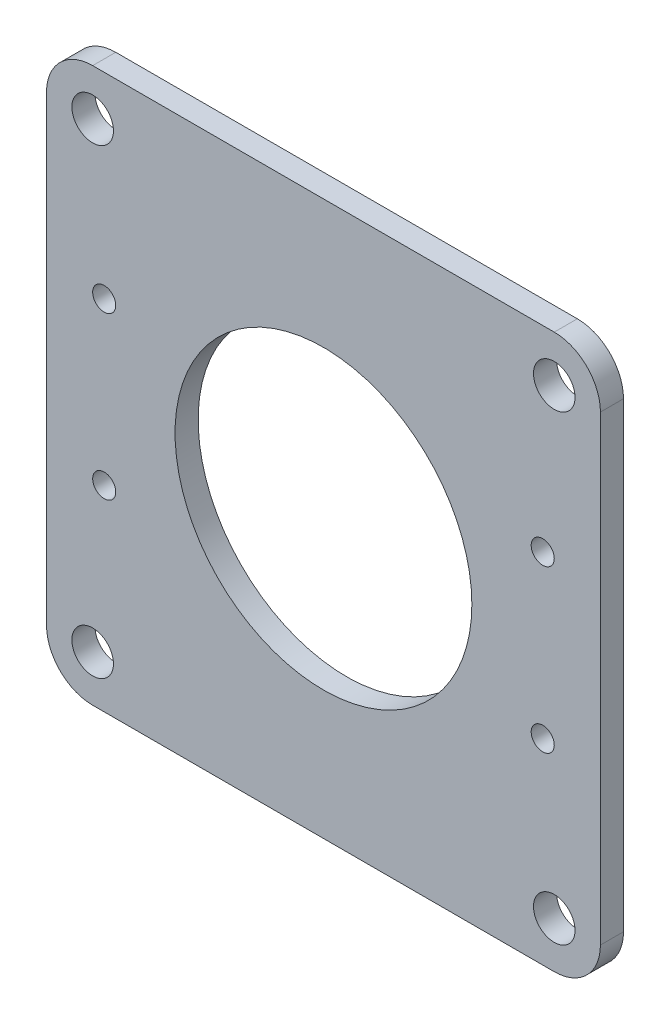
ISO-10303-21;
HEADER;
FILE_DESCRIPTION(('STEP AP214'),'2;1');
FILE_NAME('part.step','',(''),(''),'','','');
FILE_SCHEMA(('AUTOMOTIVE_DESIGN { 1 0 10303 214 1 1 1 1 }'));
ENDSEC;
DATA;
#1=APPLICATION_CONTEXT('core data for automotive mechanical design processes');
#2=APPLICATION_PROTOCOL_DEFINITION('international standard','automotive_design',2000,#1);
#3=PRODUCT_CONTEXT('',#1,'mechanical');
#4=PRODUCT('Part','Part','',(#3));
#5=PRODUCT_RELATED_PRODUCT_CATEGORY('part','',(#4));
#6=PRODUCT_DEFINITION_FORMATION('','',#4);
#7=PRODUCT_DEFINITION_CONTEXT('part definition',#1,'design');
#8=PRODUCT_DEFINITION('design','',#6,#7);
#9=PRODUCT_DEFINITION_SHAPE('','',#8);
#10=(LENGTH_UNIT() NAMED_UNIT(*) SI_UNIT(.MILLI.,.METRE.));
#11=(NAMED_UNIT(*) PLANE_ANGLE_UNIT() SI_UNIT($,.RADIAN.));
#12=(NAMED_UNIT(*) SI_UNIT($,.STERADIAN.) SOLID_ANGLE_UNIT());
#13=UNCERTAINTY_MEASURE_WITH_UNIT(LENGTH_MEASURE(1.E-05),#10,'distance_accuracy_value','');
#14=(GEOMETRIC_REPRESENTATION_CONTEXT(3) GLOBAL_UNCERTAINTY_ASSIGNED_CONTEXT((#13)) GLOBAL_UNIT_ASSIGNED_CONTEXT((#10,
#11,#12)) REPRESENTATION_CONTEXT('',''));
#15=CARTESIAN_POINT('',(0.,0.,0.));
#16=DIRECTION('',(0.,0.,1.));
#17=DIRECTION('',(1.,0.,0.));
#18=AXIS2_PLACEMENT_3D('',#15,#16,#17);
#19=CARTESIAN_POINT('',(0.,113.639067485698,5.));
#20=DIRECTION('',(0.,1.,0.));
#21=DIRECTION('',(-1.,0.,0.));
#22=AXIS2_PLACEMENT_3D('',#19,#20,#21);
#23=PLANE('',#22);
#24=DIRECTION('',(1.,0.,0.));
#25=VECTOR('',#24,1.);
#26=CARTESIAN_POINT('',(0.,113.639067485698,5.));
#27=LINE('',#26,#25);
#28=CARTESIAN_POINT('',(-40.3221278017968,113.639067485698,5.));
#29=VERTEX_POINT('',#28);
#30=CARTESIAN_POINT('',(59.6778721982036,113.639067485698,5.));
#31=VERTEX_POINT('',#30);
#32=EDGE_CURVE('E194',#29,#31,#27,.T.);
#33=ORIENTED_EDGE('',*,*,#32,.F.);
#34=DIRECTION('',(0.,0.,1.));
#35=VECTOR('',#34,1.);
#36=CARTESIAN_POINT('',(-40.3221278017968,113.639067485698,5.));
#37=LINE('',#36,#35);
#38=CARTESIAN_POINT('',(-40.3221278017968,113.639067485698,0.));
#39=VERTEX_POINT('',#38);
#40=EDGE_CURVE('E115',#29,#39,#37,.F.);
#41=ORIENTED_EDGE('',*,*,#40,.T.);
#42=DIRECTION('',(1.,0.,0.));
#43=VECTOR('',#42,1.);
#44=CARTESIAN_POINT('',(0.,113.639067485698,0.));
#45=LINE('',#44,#43);
#46=CARTESIAN_POINT('',(59.6778721982036,113.639067485698,0.));
#47=VERTEX_POINT('',#46);
#48=EDGE_CURVE('E231',#39,#47,#45,.T.);
#49=ORIENTED_EDGE('',*,*,#48,.T.);
#50=DIRECTION('',(0.,0.,1.));
#51=VECTOR('',#50,1.);
#52=CARTESIAN_POINT('',(59.6778721982036,113.639067485698,5.));
#53=LINE('',#52,#51);
#54=EDGE_CURVE('E121',#47,#31,#53,.T.);
#55=ORIENTED_EDGE('',*,*,#54,.T.);
#56=EDGE_LOOP('',(#33,#41,#49,#55));
#57=FACE_BOUND('',#56,.T.);
#58=ADVANCED_FACE('F43',(#57),#23,.F.);
#59=CARTESIAN_POINT('',(-40.3221278017959,223.639067485698,5.));
#60=DIRECTION('',(0.,0.,-1.));
#61=DIRECTION('',(-1.,0.,0.));
#62=AXIS2_PLACEMENT_3D('',#59,#60,#61);
#63=CYLINDRICAL_SURFACE('',#62,4.50000000000001);
#64=CARTESIAN_POINT('',(-40.3221278017959,223.639067485698,5.));
#65=DIRECTION('',(0.,0.,1.));
#66=DIRECTION('',(1.,0.,0.));
#67=AXIS2_PLACEMENT_3D('',#64,#65,#66);
#68=CIRCLE('',#67,4.50000000000001);
#69=CARTESIAN_POINT('',(-35.8221278017959,223.639067485698,5.));
#70=VERTEX_POINT('',#69);
#71=EDGE_CURVE('E190',#70,#70,#68,.T.);
#72=ORIENTED_EDGE('',*,*,#71,.T.);
#73=EDGE_LOOP('',(#72));
#74=FACE_BOUND('',#73,.T.);
#75=CARTESIAN_POINT('',(-40.3221278017959,223.639067485698,0.));
#76=DIRECTION('',(0.,0.,1.));
#77=DIRECTION('',(1.,0.,0.));
#78=AXIS2_PLACEMENT_3D('',#75,#76,#77);
#79=CIRCLE('',#78,4.50000000000001);
#80=CARTESIAN_POINT('',(-35.8221278017959,223.639067485698,0.));
#81=VERTEX_POINT('',#80);
#82=EDGE_CURVE('E227',#81,#81,#79,.T.);
#83=ORIENTED_EDGE('',*,*,#82,.F.);
#84=EDGE_LOOP('',(#83));
#85=FACE_BOUND('',#84,.T.);
#86=ADVANCED_FACE('F293',(#74,#85),#63,.F.);
#87=CARTESIAN_POINT('',(59.6778721982039,223.639067485698,5.));
#88=DIRECTION('',(0.,0.,-1.));
#89=DIRECTION('',(-1.,0.,0.));
#90=AXIS2_PLACEMENT_3D('',#87,#88,#89);
#91=CYLINDRICAL_SURFACE('',#90,4.5);
#92=CARTESIAN_POINT('',(59.6778721982039,223.639067485698,5.));
#93=DIRECTION('',(0.,0.,1.));
#94=DIRECTION('',(1.,0.,0.));
#95=AXIS2_PLACEMENT_3D('',#92,#93,#94);
#96=CIRCLE('',#95,4.5);
#97=CARTESIAN_POINT('',(64.1778721982039,223.639067485698,5.));
#98=VERTEX_POINT('',#97);
#99=EDGE_CURVE('E186',#98,#98,#96,.T.);
#100=ORIENTED_EDGE('',*,*,#99,.T.);
#101=EDGE_LOOP('',(#100));
#102=FACE_BOUND('',#101,.T.);
#103=CARTESIAN_POINT('',(59.6778721982039,223.639067485698,0.));
#104=DIRECTION('',(0.,0.,1.));
#105=DIRECTION('',(1.,0.,0.));
#106=AXIS2_PLACEMENT_3D('',#103,#104,#105);
#107=CIRCLE('',#106,4.5);
#108=CARTESIAN_POINT('',(64.1778721982039,223.639067485698,0.));
#109=VERTEX_POINT('',#108);
#110=EDGE_CURVE('E223',#109,#109,#107,.T.);
#111=ORIENTED_EDGE('',*,*,#110,.F.);
#112=EDGE_LOOP('',(#111));
#113=FACE_BOUND('',#112,.T.);
#114=ADVANCED_FACE('F297',(#102,#113),#91,.F.);
#115=CARTESIAN_POINT('',(57.1778721982039,191.139067485698,5.));
#116=DIRECTION('',(0.,0.,-1.));
#117=DIRECTION('',(-1.,0.,0.));
#118=AXIS2_PLACEMENT_3D('',#115,#116,#117);
#119=CYLINDRICAL_SURFACE('',#118,2.49999999999993);
#120=CARTESIAN_POINT('',(57.1778721982039,191.139067485698,5.));
#121=DIRECTION('',(0.,0.,1.));
#122=DIRECTION('',(1.,0.,0.));
#123=AXIS2_PLACEMENT_3D('',#120,#121,#122);
#124=CIRCLE('',#123,2.49999999999993);
#125=CARTESIAN_POINT('',(59.6778721982039,191.139067485698,5.));
#126=VERTEX_POINT('',#125);
#127=EDGE_CURVE('E182',#126,#126,#124,.T.);
#128=ORIENTED_EDGE('',*,*,#127,.T.);
#129=EDGE_LOOP('',(#128));
#130=FACE_BOUND('',#129,.T.);
#131=CARTESIAN_POINT('',(57.1778721982039,191.139067485698,0.));
#132=DIRECTION('',(0.,0.,1.));
#133=DIRECTION('',(1.,0.,0.));
#134=AXIS2_PLACEMENT_3D('',#131,#132,#133);
#135=CIRCLE('',#134,2.49999999999993);
#136=CARTESIAN_POINT('',(59.6778721982039,191.139067485698,0.));
#137=VERTEX_POINT('',#136);
#138=EDGE_CURVE('E220',#137,#137,#135,.T.);
#139=ORIENTED_EDGE('',*,*,#138,.F.);
#140=EDGE_LOOP('',(#139));
#141=FACE_BOUND('',#140,.T.);
#142=ADVANCED_FACE('F305',(#130,#141),#119,.F.);
#143=CARTESIAN_POINT('',(57.1778721982037,156.139067485698,5.));
#144=DIRECTION('',(0.,0.,-1.));
#145=DIRECTION('',(-1.,0.,0.));
#146=AXIS2_PLACEMENT_3D('',#143,#144,#145);
#147=CYLINDRICAL_SURFACE('',#146,2.50000000000002);
#148=CARTESIAN_POINT('',(57.1778721982037,156.139067485698,5.));
#149=DIRECTION('',(0.,0.,1.));
#150=DIRECTION('',(1.,0.,0.));
#151=AXIS2_PLACEMENT_3D('',#148,#149,#150);
#152=CIRCLE('',#151,2.50000000000002);
#153=CARTESIAN_POINT('',(59.6778721982037,156.139067485698,5.));
#154=VERTEX_POINT('',#153);
#155=EDGE_CURVE('E178',#154,#154,#152,.T.);
#156=ORIENTED_EDGE('',*,*,#155,.T.);
#157=EDGE_LOOP('',(#156));
#158=FACE_BOUND('',#157,.T.);
#159=CARTESIAN_POINT('',(57.1778721982037,156.139067485698,0.));
#160=DIRECTION('',(0.,0.,1.));
#161=DIRECTION('',(1.,0.,0.));
#162=AXIS2_PLACEMENT_3D('',#159,#160,#161);
#163=CIRCLE('',#162,2.50000000000002);
#164=CARTESIAN_POINT('',(59.6778721982037,156.139067485698,0.));
#165=VERTEX_POINT('',#164);
#166=EDGE_CURVE('E216',#165,#165,#163,.T.);
#167=ORIENTED_EDGE('',*,*,#166,.F.);
#168=EDGE_LOOP('',(#167));
#169=FACE_BOUND('',#168,.T.);
#170=ADVANCED_FACE('F309',(#158,#169),#147,.F.);
#171=CARTESIAN_POINT('',(59.6778721982039,123.639067485698,5.));
#172=DIRECTION('',(0.,0.,-1.));
#173=DIRECTION('',(-1.,0.,0.));
#174=AXIS2_PLACEMENT_3D('',#171,#172,#173);
#175=CYLINDRICAL_SURFACE('',#174,4.49999999999999);
#176=CARTESIAN_POINT('',(59.6778721982039,123.639067485698,5.));
#177=DIRECTION('',(0.,0.,1.));
#178=DIRECTION('',(1.,0.,0.));
#179=AXIS2_PLACEMENT_3D('',#176,#177,#178);
#180=CIRCLE('',#179,4.49999999999999);
#181=CARTESIAN_POINT('',(64.1778721982039,123.639067485698,5.));
#182=VERTEX_POINT('',#181);
#183=EDGE_CURVE('E174',#182,#182,#180,.T.);
#184=ORIENTED_EDGE('',*,*,#183,.T.);
#185=EDGE_LOOP('',(#184));
#186=FACE_BOUND('',#185,.T.);
#187=CARTESIAN_POINT('',(59.6778721982039,123.639067485698,0.));
#188=DIRECTION('',(0.,0.,1.));
#189=DIRECTION('',(1.,0.,0.));
#190=AXIS2_PLACEMENT_3D('',#187,#188,#189);
#191=CIRCLE('',#190,4.49999999999999);
#192=CARTESIAN_POINT('',(64.1778721982039,123.639067485698,0.));
#193=VERTEX_POINT('',#192);
#194=EDGE_CURVE('E212',#193,#193,#191,.T.);
#195=ORIENTED_EDGE('',*,*,#194,.F.);
#196=EDGE_LOOP('',(#195));
#197=FACE_BOUND('',#196,.T.);
#198=ADVANCED_FACE('F313',(#186,#197),#175,.F.);
#199=CARTESIAN_POINT('',(-40.3221278017963,123.639067485698,5.));
#200=DIRECTION('',(0.,0.,-1.));
#201=DIRECTION('',(-1.,0.,0.));
#202=AXIS2_PLACEMENT_3D('',#199,#200,#201);
#203=CYLINDRICAL_SURFACE('',#202,4.49999999999994);
#204=CARTESIAN_POINT('',(-40.3221278017963,123.639067485698,5.));
#205=DIRECTION('',(0.,0.,1.));
#206=DIRECTION('',(1.,0.,0.));
#207=AXIS2_PLACEMENT_3D('',#204,#205,#206);
#208=CIRCLE('',#207,4.49999999999994);
#209=CARTESIAN_POINT('',(-35.8221278017964,123.639067485698,5.));
#210=VERTEX_POINT('',#209);
#211=EDGE_CURVE('E170',#210,#210,#208,.T.);
#212=ORIENTED_EDGE('',*,*,#211,.T.);
#213=EDGE_LOOP('',(#212));
#214=FACE_BOUND('',#213,.T.);
#215=CARTESIAN_POINT('',(-40.3221278017963,123.639067485698,0.));
#216=DIRECTION('',(0.,0.,1.));
#217=DIRECTION('',(1.,0.,0.));
#218=AXIS2_PLACEMENT_3D('',#215,#216,#217);
#219=CIRCLE('',#218,4.49999999999994);
#220=CARTESIAN_POINT('',(-35.8221278017964,123.639067485698,0.));
#221=VERTEX_POINT('',#220);
#222=EDGE_CURVE('E208',#221,#221,#219,.T.);
#223=ORIENTED_EDGE('',*,*,#222,.F.);
#224=EDGE_LOOP('',(#223));
#225=FACE_BOUND('',#224,.T.);
#226=ADVANCED_FACE('F317',(#214,#225),#203,.F.);
#227=CARTESIAN_POINT('',(-37.8221278017961,156.139067485698,5.));
#228=DIRECTION('',(0.,0.,-1.));
#229=DIRECTION('',(-1.,0.,0.));
#230=AXIS2_PLACEMENT_3D('',#227,#228,#229);
#231=CYLINDRICAL_SURFACE('',#230,2.49999999999994);
#232=CARTESIAN_POINT('',(-37.8221278017961,156.139067485698,5.));
#233=DIRECTION('',(0.,0.,1.));
#234=DIRECTION('',(1.,0.,0.));
#235=AXIS2_PLACEMENT_3D('',#232,#233,#234);
#236=CIRCLE('',#235,2.49999999999994);
#237=CARTESIAN_POINT('',(-35.3221278017962,156.139067485698,5.));
#238=VERTEX_POINT('',#237);
#239=EDGE_CURVE('E165',#238,#238,#236,.T.);
#240=ORIENTED_EDGE('',*,*,#239,.T.);
#241=EDGE_LOOP('',(#240));
#242=FACE_BOUND('',#241,.T.);
#243=CARTESIAN_POINT('',(-37.8221278017961,156.139067485698,0.));
#244=DIRECTION('',(0.,0.,1.));
#245=DIRECTION('',(1.,0.,0.));
#246=AXIS2_PLACEMENT_3D('',#243,#244,#245);
#247=CIRCLE('',#246,2.49999999999994);
#248=CARTESIAN_POINT('',(-35.3221278017962,156.139067485698,0.));
#249=VERTEX_POINT('',#248);
#250=EDGE_CURVE('E204',#249,#249,#247,.T.);
#251=ORIENTED_EDGE('',*,*,#250,.F.);
#252=EDGE_LOOP('',(#251));
#253=FACE_BOUND('',#252,.T.);
#254=ADVANCED_FACE('F321',(#242,#253),#231,.F.);
#255=CARTESIAN_POINT('',(-37.822127801796,191.139067485698,5.));
#256=DIRECTION('',(0.,0.,-1.));
#257=DIRECTION('',(-1.,0.,0.));
#258=AXIS2_PLACEMENT_3D('',#255,#256,#257);
#259=CYLINDRICAL_SURFACE('',#258,2.49999999999993);
#260=CARTESIAN_POINT('',(-37.822127801796,191.139067485698,5.));
#261=DIRECTION('',(0.,0.,1.));
#262=DIRECTION('',(1.,0.,0.));
#263=AXIS2_PLACEMENT_3D('',#260,#261,#262);
#264=CIRCLE('',#263,2.49999999999993);
#265=CARTESIAN_POINT('',(-35.3221278017961,191.139067485698,5.));
#266=VERTEX_POINT('',#265);
#267=EDGE_CURVE('E161',#266,#266,#264,.T.);
#268=ORIENTED_EDGE('',*,*,#267,.T.);
#269=EDGE_LOOP('',(#268));
#270=FACE_BOUND('',#269,.T.);
#271=CARTESIAN_POINT('',(-37.822127801796,191.139067485698,0.));
#272=DIRECTION('',(0.,0.,1.));
#273=DIRECTION('',(1.,0.,0.));
#274=AXIS2_PLACEMENT_3D('',#271,#272,#273);
#275=CIRCLE('',#274,2.49999999999993);
#276=CARTESIAN_POINT('',(-35.3221278017961,191.139067485698,0.));
#277=VERTEX_POINT('',#276);
#278=EDGE_CURVE('E160',#277,#277,#275,.T.);
#279=ORIENTED_EDGE('',*,*,#278,.F.);
#280=EDGE_LOOP('',(#279));
#281=FACE_BOUND('',#280,.T.);
#282=ADVANCED_FACE('F325',(#270,#281),#259,.F.);
#283=CARTESIAN_POINT('',(0.,233.639067485698,5.));
#284=DIRECTION('',(0.,1.,0.));
#285=DIRECTION('',(0.,0.,1.));
#286=AXIS2_PLACEMENT_3D('',#283,#284,#285);
#287=PLANE('',#286);
#288=DIRECTION('',(1.,0.,0.));
#289=VECTOR('',#288,1.);
#290=CARTESIAN_POINT('',(0.,233.639067485698,5.));
#291=LINE('',#290,#289);
#292=CARTESIAN_POINT('',(-40.3221278017987,233.639067485698,5.));
#293=VERTEX_POINT('',#292);
#294=CARTESIAN_POINT('',(59.6778721982055,233.639067485698,5.));
#295=VERTEX_POINT('',#294);
#296=EDGE_CURVE('E197',#293,#295,#291,.T.);
#297=ORIENTED_EDGE('',*,*,#296,.T.);
#298=DIRECTION('',(0.,0.,1.));
#299=VECTOR('',#298,1.);
#300=CARTESIAN_POINT('',(59.6778721982055,233.639067485698,0.));
#301=LINE('',#300,#299);
#302=CARTESIAN_POINT('',(59.6778721982055,233.639067485698,0.));
#303=VERTEX_POINT('',#302);
#304=EDGE_CURVE('E11',#295,#303,#301,.F.);
#305=ORIENTED_EDGE('',*,*,#304,.T.);
#306=DIRECTION('',(1.,0.,0.));
#307=VECTOR('',#306,1.);
#308=CARTESIAN_POINT('',(0.,233.639067485698,0.));
#309=LINE('',#308,#307);
#310=CARTESIAN_POINT('',(-40.3221278017987,233.639067485698,0.));
#311=VERTEX_POINT('',#310);
#312=EDGE_CURVE('E166',#311,#303,#309,.T.);
#313=ORIENTED_EDGE('',*,*,#312,.F.);
#314=DIRECTION('',(0.,0.,1.));
#315=VECTOR('',#314,1.);
#316=CARTESIAN_POINT('',(-40.3221278017987,233.639067485698,5.));
#317=LINE('',#316,#315);
#318=EDGE_CURVE('E52',#311,#293,#317,.T.);
#319=ORIENTED_EDGE('',*,*,#318,.T.);
#320=EDGE_LOOP('',(#297,#305,#313,#319));
#321=FACE_BOUND('',#320,.T.);
#322=ADVANCED_FACE('F271',(#321),#287,.T.);
#323=CARTESIAN_POINT('',(0.,0.,5.));
#324=DIRECTION('',(0.,0.,1.));
#325=DIRECTION('',(1.,0.,0.));
#326=AXIS2_PLACEMENT_3D('',#323,#324,#325);
#327=PLANE('',#326);
#328=DIRECTION('',(0.,1.,0.));
#329=VECTOR('',#328,1.);
#330=CARTESIAN_POINT('',(-50.3221278017966,113.639067485698,5.));
#331=LINE('',#330,#329);
#332=CARTESIAN_POINT('',(-50.3221278017968,123.639067485698,5.));
#333=VERTEX_POINT('',#332);
#334=CARTESIAN_POINT('',(-50.3221278017987,223.639067485698,5.));
#335=VERTEX_POINT('',#334);
#336=EDGE_CURVE('E128',#333,#335,#331,.T.);
#337=ORIENTED_EDGE('',*,*,#336,.F.);
#338=CARTESIAN_POINT('',(-40.3221278017968,123.639067485698,5.));
#339=DIRECTION('',(0.,0.,1.));
#340=DIRECTION('',(1.,0.,0.));
#341=AXIS2_PLACEMENT_3D('',#338,#339,#340);
#342=CIRCLE('',#341,10.);
#343=EDGE_CURVE('E110',#333,#29,#342,.T.);
#344=ORIENTED_EDGE('',*,*,#343,.T.);
#345=ORIENTED_EDGE('',*,*,#32,.T.);
#346=CARTESIAN_POINT('',(59.6778721982036,123.639067485698,5.));
#347=DIRECTION('',(0.,0.,1.));
#348=DIRECTION('',(1.,0.,0.));
#349=AXIS2_PLACEMENT_3D('',#346,#347,#348);
#350=CIRCLE('',#349,10.);
#351=CARTESIAN_POINT('',(69.6778721982036,123.639067485698,5.));
#352=VERTEX_POINT('',#351);
#353=EDGE_CURVE('E122',#31,#352,#350,.T.);
#354=ORIENTED_EDGE('',*,*,#353,.T.);
#355=DIRECTION('',(0.,-1.,0.));
#356=VECTOR('',#355,1.);
#357=CARTESIAN_POINT('',(69.6778721982034,113.639067485698,5.));
#358=LINE('',#357,#356);
#359=CARTESIAN_POINT('',(69.6778721982054,223.639067485698,5.));
#360=VERTEX_POINT('',#359);
#361=EDGE_CURVE('E140',#360,#352,#358,.T.);
#362=ORIENTED_EDGE('',*,*,#361,.F.);
#363=CARTESIAN_POINT('',(59.6778721982055,223.639067485698,5.));
#364=DIRECTION('',(0.,0.,1.));
#365=DIRECTION('',(1.,0.,0.));
#366=AXIS2_PLACEMENT_3D('',#363,#364,#365);
#367=CIRCLE('',#366,10.);
#368=EDGE_CURVE('E241',#360,#295,#367,.T.);
#369=ORIENTED_EDGE('',*,*,#368,.T.);
#370=ORIENTED_EDGE('',*,*,#296,.F.);
#371=CARTESIAN_POINT('',(-40.3221278017987,223.639067485698,5.));
#372=DIRECTION('',(0.,0.,1.));
#373=DIRECTION('',(1.,0.,0.));
#374=AXIS2_PLACEMENT_3D('',#371,#372,#373);
#375=CIRCLE('',#374,10.);
#376=EDGE_CURVE('E133',#293,#335,#375,.T.);
#377=ORIENTED_EDGE('',*,*,#376,.T.);
#378=EDGE_LOOP('',(#337,#344,#345,#354,#362,#369,#370,#377));
#379=FACE_BOUND('',#378,.T.);
#380=ORIENTED_EDGE('',*,*,#267,.F.);
#381=EDGE_LOOP('',(#380));
#382=FACE_BOUND('',#381,.T.);
#383=ORIENTED_EDGE('',*,*,#239,.F.);
#384=EDGE_LOOP('',(#383));
#385=FACE_BOUND('',#384,.T.);
#386=ORIENTED_EDGE('',*,*,#211,.F.);
#387=EDGE_LOOP('',(#386));
#388=FACE_BOUND('',#387,.T.);
#389=ORIENTED_EDGE('',*,*,#183,.F.);
#390=EDGE_LOOP('',(#389));
#391=FACE_BOUND('',#390,.T.);
#392=ORIENTED_EDGE('',*,*,#155,.F.);
#393=EDGE_LOOP('',(#392));
#394=FACE_BOUND('',#393,.T.);
#395=ORIENTED_EDGE('',*,*,#127,.F.);
#396=EDGE_LOOP('',(#395));
#397=FACE_BOUND('',#396,.T.);
#398=ORIENTED_EDGE('',*,*,#99,.F.);
#399=EDGE_LOOP('',(#398));
#400=FACE_BOUND('',#399,.T.);
#401=ORIENTED_EDGE('',*,*,#71,.F.);
#402=EDGE_LOOP('',(#401));
#403=FACE_BOUND('',#402,.T.);
#404=CARTESIAN_POINT('',(9.6778721982034,173.639067485698,5.));
#405=DIRECTION('',(0.,0.,1.));
#406=DIRECTION('',(1.,0.,0.));
#407=AXIS2_PLACEMENT_3D('',#404,#405,#406);
#408=CIRCLE('',#407,32.15);
#409=CARTESIAN_POINT('',(41.8278721982034,173.639067485698,5.));
#410=VERTEX_POINT('',#409);
#411=EDGE_CURVE('E145',#410,#410,#408,.T.);
#412=ORIENTED_EDGE('',*,*,#411,.F.);
#413=EDGE_LOOP('',(#412));
#414=FACE_BOUND('',#413,.T.);
#415=ADVANCED_FACE('F136',(#379,#382,#385,#388,#391,#394,#397,#400,#403,#414),#327,.T.);
#416=CARTESIAN_POINT('',(0.,0.,0.));
#417=DIRECTION('',(0.,0.,1.));
#418=DIRECTION('',(1.,0.,0.));
#419=AXIS2_PLACEMENT_3D('',#416,#417,#418);
#420=PLANE('',#419);
#421=ORIENTED_EDGE('',*,*,#278,.T.);
#422=EDGE_LOOP('',(#421));
#423=FACE_BOUND('',#422,.T.);
#424=ORIENTED_EDGE('',*,*,#250,.T.);
#425=EDGE_LOOP('',(#424));
#426=FACE_BOUND('',#425,.T.);
#427=ORIENTED_EDGE('',*,*,#222,.T.);
#428=EDGE_LOOP('',(#427));
#429=FACE_BOUND('',#428,.T.);
#430=ORIENTED_EDGE('',*,*,#194,.T.);
#431=EDGE_LOOP('',(#430));
#432=FACE_BOUND('',#431,.T.);
#433=ORIENTED_EDGE('',*,*,#166,.T.);
#434=EDGE_LOOP('',(#433));
#435=FACE_BOUND('',#434,.T.);
#436=ORIENTED_EDGE('',*,*,#138,.T.);
#437=EDGE_LOOP('',(#436));
#438=FACE_BOUND('',#437,.T.);
#439=ORIENTED_EDGE('',*,*,#110,.T.);
#440=EDGE_LOOP('',(#439));
#441=FACE_BOUND('',#440,.T.);
#442=ORIENTED_EDGE('',*,*,#82,.T.);
#443=EDGE_LOOP('',(#442));
#444=FACE_BOUND('',#443,.T.);
#445=ORIENTED_EDGE('',*,*,#48,.F.);
#446=CARTESIAN_POINT('',(-40.3221278017968,123.639067485698,0.));
#447=DIRECTION('',(0.,0.,1.));
#448=DIRECTION('',(1.,0.,0.));
#449=AXIS2_PLACEMENT_3D('',#446,#447,#448);
#450=CIRCLE('',#449,10.);
#451=CARTESIAN_POINT('',(-50.3221278017968,123.639067485698,0.));
#452=VERTEX_POINT('',#451);
#453=EDGE_CURVE('E258',#39,#452,#450,.F.);
#454=ORIENTED_EDGE('',*,*,#453,.T.);
#455=DIRECTION('',(0.,1.,0.));
#456=VECTOR('',#455,1.);
#457=CARTESIAN_POINT('',(-50.3221278017966,113.639067485698,0.));
#458=LINE('',#457,#456);
#459=CARTESIAN_POINT('',(-50.3221278017987,223.639067485698,0.));
#460=VERTEX_POINT('',#459);
#461=EDGE_CURVE('E131',#452,#460,#458,.T.);
#462=ORIENTED_EDGE('',*,*,#461,.T.);
#463=CARTESIAN_POINT('',(-40.3221278017987,223.639067485698,0.));
#464=DIRECTION('',(0.,0.,1.));
#465=DIRECTION('',(1.,0.,0.));
#466=AXIS2_PLACEMENT_3D('',#463,#464,#465);
#467=CIRCLE('',#466,10.);
#468=EDGE_CURVE('E250',#460,#311,#467,.F.);
#469=ORIENTED_EDGE('',*,*,#468,.T.);
#470=ORIENTED_EDGE('',*,*,#312,.T.);
#471=CARTESIAN_POINT('',(59.6778721982055,223.639067485698,0.));
#472=DIRECTION('',(0.,0.,1.));
#473=DIRECTION('',(1.,0.,0.));
#474=AXIS2_PLACEMENT_3D('',#471,#472,#473);
#475=CIRCLE('',#474,10.);
#476=CARTESIAN_POINT('',(69.6778721982054,223.639067485698,0.));
#477=VERTEX_POINT('',#476);
#478=EDGE_CURVE('E66',#303,#477,#475,.F.);
#479=ORIENTED_EDGE('',*,*,#478,.T.);
#480=DIRECTION('',(0.,-1.,0.));
#481=VECTOR('',#480,1.);
#482=CARTESIAN_POINT('',(69.6778721982034,113.639067485698,0.));
#483=LINE('',#482,#481);
#484=CARTESIAN_POINT('',(69.6778721982036,123.639067485698,0.));
#485=VERTEX_POINT('',#484);
#486=EDGE_CURVE('E148',#477,#485,#483,.T.);
#487=ORIENTED_EDGE('',*,*,#486,.T.);
#488=CARTESIAN_POINT('',(59.6778721982036,123.639067485698,0.));
#489=DIRECTION('',(0.,0.,1.));
#490=DIRECTION('',(1.,0.,0.));
#491=AXIS2_PLACEMENT_3D('',#488,#489,#490);
#492=CIRCLE('',#491,10.);
#493=EDGE_CURVE('E255',#485,#47,#492,.F.);
#494=ORIENTED_EDGE('',*,*,#493,.T.);
#495=EDGE_LOOP('',(#445,#454,#462,#469,#470,#479,#487,#494));
#496=FACE_BOUND('',#495,.T.);
#497=CARTESIAN_POINT('',(9.6778721982034,173.639067485698,0.));
#498=DIRECTION('',(0.,0.,1.));
#499=DIRECTION('',(1.,0.,0.));
#500=AXIS2_PLACEMENT_3D('',#497,#498,#499);
#501=CIRCLE('',#500,32.15);
#502=CARTESIAN_POINT('',(41.8278721982034,173.639067485698,0.));
#503=VERTEX_POINT('',#502);
#504=EDGE_CURVE('E156',#503,#503,#501,.F.);
#505=ORIENTED_EDGE('',*,*,#504,.F.);
#506=EDGE_LOOP('',(#505));
#507=FACE_BOUND('',#506,.T.);
#508=ADVANCED_FACE('F282',(#423,#426,#429,#432,#435,#438,#441,#444,#496,#507),#420,.F.);
#509=CARTESIAN_POINT('',(9.6778721982034,173.639067485698,-110.308657865102));
#510=DIRECTION('',(0.,0.,1.));
#511=DIRECTION('',(1.,0.,0.));
#512=AXIS2_PLACEMENT_3D('',#509,#510,#511);
#513=CYLINDRICAL_SURFACE('',#512,32.15);
#514=ORIENTED_EDGE('',*,*,#504,.T.);
#515=EDGE_LOOP('',(#514));
#516=FACE_BOUND('',#515,.T.);
#517=ORIENTED_EDGE('',*,*,#411,.T.);
#518=EDGE_LOOP('',(#517));
#519=FACE_BOUND('',#518,.T.);
#520=ADVANCED_FACE('F384',(#516,#519),#513,.F.);
#521=CARTESIAN_POINT('',(69.6778721982034,113.639067485698,0.));
#522=DIRECTION('',(-1.,0.,0.));
#523=DIRECTION('',(0.,-1.,0.));
#524=AXIS2_PLACEMENT_3D('',#521,#522,#523);
#525=PLANE('',#524);
#526=ORIENTED_EDGE('',*,*,#361,.T.);
#527=DIRECTION('',(0.,0.,1.));
#528=VECTOR('',#527,1.);
#529=CARTESIAN_POINT('',(69.6778721982036,123.639067485698,0.));
#530=LINE('',#529,#528);
#531=EDGE_CURVE('E59',#352,#485,#530,.F.);
#532=ORIENTED_EDGE('',*,*,#531,.T.);
#533=ORIENTED_EDGE('',*,*,#486,.F.);
#534=DIRECTION('',(0.,0.,1.));
#535=VECTOR('',#534,1.);
#536=CARTESIAN_POINT('',(69.6778721982054,223.639067485698,5.));
#537=LINE('',#536,#535);
#538=EDGE_CURVE('E261',#477,#360,#537,.T.);
#539=ORIENTED_EDGE('',*,*,#538,.T.);
#540=EDGE_LOOP('',(#526,#532,#533,#539));
#541=FACE_BOUND('',#540,.T.);
#542=ADVANCED_FACE('F279',(#541),#525,.F.);
#543=CARTESIAN_POINT('',(-50.3221278017966,113.639067485698,0.));
#544=DIRECTION('',(1.,0.,0.));
#545=DIRECTION('',(0.,1.,0.));
#546=AXIS2_PLACEMENT_3D('',#543,#544,#545);
#547=PLANE('',#546);
#548=ORIENTED_EDGE('',*,*,#461,.F.);
#549=DIRECTION('',(0.,0.,1.));
#550=VECTOR('',#549,1.);
#551=CARTESIAN_POINT('',(-50.3221278017968,123.639067485698,0.));
#552=LINE('',#551,#550);
#553=EDGE_CURVE('E114',#452,#333,#552,.T.);
#554=ORIENTED_EDGE('',*,*,#553,.T.);
#555=ORIENTED_EDGE('',*,*,#336,.T.);
#556=DIRECTION('',(0.,0.,1.));
#557=VECTOR('',#556,1.);
#558=CARTESIAN_POINT('',(-50.3221278017987,223.639067485698,0.));
#559=LINE('',#558,#557);
#560=EDGE_CURVE('E134',#335,#460,#559,.F.);
#561=ORIENTED_EDGE('',*,*,#560,.T.);
#562=EDGE_LOOP('',(#548,#554,#555,#561));
#563=FACE_BOUND('',#562,.T.);
#564=ADVANCED_FACE('F127',(#563),#547,.F.);
#565=CARTESIAN_POINT('',(-40.3221278017968,123.639067485698,0.));
#566=DIRECTION('',(0.,0.,1.));
#567=DIRECTION('',(1.,0.,0.));
#568=AXIS2_PLACEMENT_3D('',#565,#566,#567);
#569=CYLINDRICAL_SURFACE('',#568,10.);
#570=ORIENTED_EDGE('',*,*,#453,.F.);
#571=ORIENTED_EDGE('',*,*,#40,.F.);
#572=ORIENTED_EDGE('',*,*,#343,.F.);
#573=ORIENTED_EDGE('',*,*,#553,.F.);
#574=EDGE_LOOP('',(#570,#571,#572,#573));
#575=FACE_BOUND('',#574,.T.);
#576=ADVANCED_FACE('F113',(#575),#569,.T.);
#577=CARTESIAN_POINT('',(59.6778721982036,123.639067485698,5.));
#578=DIRECTION('',(0.,0.,1.));
#579=DIRECTION('',(1.,0.,0.));
#580=AXIS2_PLACEMENT_3D('',#577,#578,#579);
#581=CYLINDRICAL_SURFACE('',#580,10.);
#582=ORIENTED_EDGE('',*,*,#493,.F.);
#583=ORIENTED_EDGE('',*,*,#531,.F.);
#584=ORIENTED_EDGE('',*,*,#353,.F.);
#585=ORIENTED_EDGE('',*,*,#54,.F.);
#586=EDGE_LOOP('',(#582,#583,#584,#585));
#587=FACE_BOUND('',#586,.T.);
#588=ADVANCED_FACE('F286',(#587),#581,.T.);
#589=CARTESIAN_POINT('',(59.6778721982055,223.639067485698,0.));
#590=DIRECTION('',(0.,0.,-1.));
#591=DIRECTION('',(-1.,0.,0.));
#592=AXIS2_PLACEMENT_3D('',#589,#590,#591);
#593=CYLINDRICAL_SURFACE('',#592,10.);
#594=ORIENTED_EDGE('',*,*,#478,.F.);
#595=ORIENTED_EDGE('',*,*,#304,.F.);
#596=ORIENTED_EDGE('',*,*,#368,.F.);
#597=ORIENTED_EDGE('',*,*,#538,.F.);
#598=EDGE_LOOP('',(#594,#595,#596,#597));
#599=FACE_BOUND('',#598,.T.);
#600=ADVANCED_FACE('F278',(#599),#593,.T.);
#601=CARTESIAN_POINT('',(-40.3221278017987,223.639067485698,5.));
#602=DIRECTION('',(0.,0.,-1.));
#603=DIRECTION('',(-1.,0.,0.));
#604=AXIS2_PLACEMENT_3D('',#601,#602,#603);
#605=CYLINDRICAL_SURFACE('',#604,10.);
#606=ORIENTED_EDGE('',*,*,#468,.F.);
#607=ORIENTED_EDGE('',*,*,#560,.F.);
#608=ORIENTED_EDGE('',*,*,#376,.F.);
#609=ORIENTED_EDGE('',*,*,#318,.F.);
#610=EDGE_LOOP('',(#606,#607,#608,#609));
#611=FACE_BOUND('',#610,.T.);
#612=ADVANCED_FACE('F45',(#611),#605,.T.);
#613=CLOSED_SHELL('',(#58,#86,#114,#142,#170,#198,#226,#254,#282,#322,#415,#508,#520,#542,#564,
#576,#588,#600,#612));
#614=MANIFOLD_SOLID_BREP('B2',#613);
#615=ADVANCED_BREP_SHAPE_REPRESENTATION('',(#18,#614),#14);
#616=SHAPE_DEFINITION_REPRESENTATION(#9,#615);
ENDSEC;
END-ISO-10303-21;
